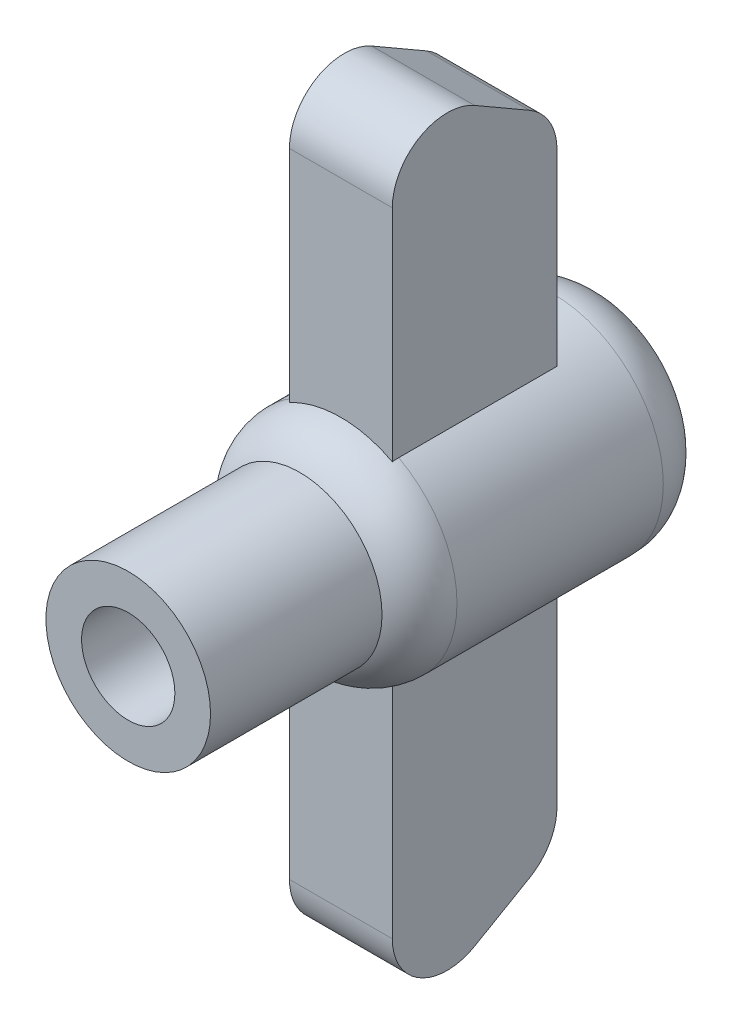
ISO-10303-21;
HEADER;
FILE_DESCRIPTION(('STEP AP214'),'2;1');
FILE_NAME('part.step','',(''),(''),'','','');
FILE_SCHEMA(('AUTOMOTIVE_DESIGN { 1 0 10303 214 1 1 1 1 }'));
ENDSEC;
DATA;
#1=APPLICATION_CONTEXT('core data for automotive mechanical design processes');
#2=APPLICATION_PROTOCOL_DEFINITION('international standard','automotive_design',2000,#1);
#3=PRODUCT_CONTEXT('',#1,'mechanical');
#4=PRODUCT('Part','Part','',(#3));
#5=PRODUCT_RELATED_PRODUCT_CATEGORY('part','',(#4));
#6=PRODUCT_DEFINITION_FORMATION('','',#4);
#7=PRODUCT_DEFINITION_CONTEXT('part definition',#1,'design');
#8=PRODUCT_DEFINITION('design','',#6,#7);
#9=PRODUCT_DEFINITION_SHAPE('','',#8);
#10=(LENGTH_UNIT() NAMED_UNIT(*) SI_UNIT(.MILLI.,.METRE.));
#11=(NAMED_UNIT(*) PLANE_ANGLE_UNIT() SI_UNIT($,.RADIAN.));
#12=(NAMED_UNIT(*) SI_UNIT($,.STERADIAN.) SOLID_ANGLE_UNIT());
#13=UNCERTAINTY_MEASURE_WITH_UNIT(LENGTH_MEASURE(1.E-05),#10,'distance_accuracy_value','');
#14=(GEOMETRIC_REPRESENTATION_CONTEXT(3) GLOBAL_UNCERTAINTY_ASSIGNED_CONTEXT((#13)) GLOBAL_UNIT_ASSIGNED_CONTEXT((#10,
#11,#12)) REPRESENTATION_CONTEXT('',''));
#15=CARTESIAN_POINT('',(0.,0.,0.));
#16=DIRECTION('',(0.,0.,1.));
#17=DIRECTION('',(1.,0.,0.));
#18=AXIS2_PLACEMENT_3D('',#15,#16,#17);
#19=CARTESIAN_POINT('',(0.,0.,0.));
#20=DIRECTION('',(0.,0.,1.));
#21=DIRECTION('',(1.,0.,0.));
#22=AXIS2_PLACEMENT_3D('',#19,#20,#21);
#23=CYLINDRICAL_SURFACE('',#22,7.99999999999999);
#24=CARTESIAN_POINT('',(0.,0.,-31.));
#25=DIRECTION('',(0.,0.,1.));
#26=DIRECTION('',(1.,0.,0.));
#27=AXIS2_PLACEMENT_3D('',#24,#25,#26);
#28=CIRCLE('',#27,7.99999999999999);
#29=CARTESIAN_POINT('',(7.99999999999999,0.,-31.));
#30=VERTEX_POINT('',#29);
#31=EDGE_CURVE('E241',#30,#30,#28,.T.);
#32=ORIENTED_EDGE('',*,*,#31,.T.);
#33=EDGE_LOOP('',(#32));
#34=FACE_BOUND('',#33,.T.);
#35=DIRECTION('',(0.,0.,1.));
#36=VECTOR('',#35,1.);
#37=CARTESIAN_POINT('',(3.75,7.06664701255127,0.));
#38=LINE('',#37,#36);
#39=CARTESIAN_POINT('',(3.75,7.06664701255127,-15.964101615138));
#40=VERTEX_POINT('',#39);
#41=CARTESIAN_POINT('',(3.75,7.06664701255128,-27.5));
#42=VERTEX_POINT('',#41);
#43=EDGE_CURVE('E203',#40,#42,#38,.F.);
#44=ORIENTED_EDGE('',*,*,#43,.F.);
#45=CARTESIAN_POINT('',(0.,0.,-15.9641016151378));
#46=DIRECTION('',(0.,0.,1.));
#47=DIRECTION('',(1.,0.,0.));
#48=AXIS2_PLACEMENT_3D('',#45,#46,#47);
#49=CIRCLE('',#48,7.99999999999999);
#50=CARTESIAN_POINT('',(3.75,-7.06664701255127,-15.964101615138));
#51=VERTEX_POINT('',#50);
#52=EDGE_CURVE('E246',#40,#51,#49,.F.);
#53=ORIENTED_EDGE('',*,*,#52,.T.);
#54=DIRECTION('',(0.,0.,1.));
#55=VECTOR('',#54,1.);
#56=CARTESIAN_POINT('',(3.75,-7.06664701255127,0.));
#57=LINE('',#56,#55);
#58=CARTESIAN_POINT('',(3.75,-7.06664701255128,-27.5));
#59=VERTEX_POINT('',#58);
#60=EDGE_CURVE('E196',#59,#51,#57,.T.);
#61=ORIENTED_EDGE('',*,*,#60,.F.);
#62=CARTESIAN_POINT('',(0.,0.,-27.5));
#63=DIRECTION('',(0.,0.,1.));
#64=DIRECTION('',(1.,0.,0.));
#65=AXIS2_PLACEMENT_3D('',#62,#63,#64);
#66=CIRCLE('',#65,7.99999999999999);
#67=CARTESIAN_POINT('',(-3.75,-7.06664701255128,-27.5));
#68=VERTEX_POINT('',#67);
#69=EDGE_CURVE('E193',#68,#59,#66,.T.);
#70=ORIENTED_EDGE('',*,*,#69,.F.);
#71=DIRECTION('',(0.,0.,1.));
#72=VECTOR('',#71,1.);
#73=CARTESIAN_POINT('',(-3.75,-7.06664701255127,0.));
#74=LINE('',#73,#72);
#75=CARTESIAN_POINT('',(-3.75,-7.06664701255127,-15.964101615138));
#76=VERTEX_POINT('',#75);
#77=EDGE_CURVE('E191',#76,#68,#74,.F.);
#78=ORIENTED_EDGE('',*,*,#77,.F.);
#79=CARTESIAN_POINT('',(0.,0.,-15.9641016151378));
#80=DIRECTION('',(0.,0.,1.));
#81=DIRECTION('',(1.,0.,0.));
#82=AXIS2_PLACEMENT_3D('',#79,#80,#81);
#83=CIRCLE('',#82,7.99999999999999);
#84=CARTESIAN_POINT('',(-3.75,7.06664701255127,-15.964101615138));
#85=VERTEX_POINT('',#84);
#86=EDGE_CURVE('E244',#76,#85,#83,.F.);
#87=ORIENTED_EDGE('',*,*,#86,.T.);
#88=DIRECTION('',(0.,0.,1.));
#89=VECTOR('',#88,1.);
#90=CARTESIAN_POINT('',(-3.75,7.06664701255127,0.));
#91=LINE('',#90,#89);
#92=CARTESIAN_POINT('',(-3.75,7.06664701255127,-27.5));
#93=VERTEX_POINT('',#92);
#94=EDGE_CURVE('E200',#93,#85,#91,.T.);
#95=ORIENTED_EDGE('',*,*,#94,.F.);
#96=EDGE_CURVE('E197',#42,#93,#66,.T.);
#97=ORIENTED_EDGE('',*,*,#96,.F.);
#98=EDGE_LOOP('',(#44,#53,#61,#70,#78,#87,#95,#97));
#99=FACE_BOUND('',#98,.T.);
#100=ADVANCED_FACE('F41',(#34,#99),#23,.T.);
#101=CARTESIAN_POINT('',(0.,0.,0.));
#102=DIRECTION('',(0.,0.,1.));
#103=DIRECTION('',(1.,0.,0.));
#104=AXIS2_PLACEMENT_3D('',#101,#102,#103);
#105=CYLINDRICAL_SURFACE('',#104,6.);
#106=CARTESIAN_POINT('',(0.,0.,0.));
#107=DIRECTION('',(0.,0.,1.));
#108=DIRECTION('',(1.,0.,0.));
#109=AXIS2_PLACEMENT_3D('',#106,#107,#108);
#110=CIRCLE('',#109,6.);
#111=CARTESIAN_POINT('',(6.,0.,0.));
#112=VERTEX_POINT('',#111);
#113=EDGE_CURVE('E185',#112,#112,#110,.T.);
#114=ORIENTED_EDGE('',*,*,#113,.F.);
#115=EDGE_LOOP('',(#114));
#116=FACE_BOUND('',#115,.T.);
#117=CARTESIAN_POINT('',(0.,0.,-12.5));
#118=DIRECTION('',(0.,0.,1.));
#119=DIRECTION('',(1.,0.,0.));
#120=AXIS2_PLACEMENT_3D('',#117,#118,#119);
#121=CIRCLE('',#120,6.);
#122=CARTESIAN_POINT('',(6.,0.,-12.5));
#123=VERTEX_POINT('',#122);
#124=EDGE_CURVE('E188',#123,#123,#121,.T.);
#125=ORIENTED_EDGE('',*,*,#124,.T.);
#126=EDGE_LOOP('',(#125));
#127=FACE_BOUND('',#126,.T.);
#128=ADVANCED_FACE('F313',(#116,#127),#105,.T.);
#129=CARTESIAN_POINT('',(0.,0.,0.));
#130=DIRECTION('',(0.,0.,-1.));
#131=DIRECTION('',(-1.,0.,0.));
#132=AXIS2_PLACEMENT_3D('',#129,#130,#131);
#133=PLANE('',#132);
#134=CARTESIAN_POINT('',(0.,0.,0.));
#135=DIRECTION('',(0.,0.,1.));
#136=DIRECTION('',(1.,0.,0.));
#137=AXIS2_PLACEMENT_3D('',#134,#135,#136);
#138=CIRCLE('',#137,3.4);
#139=CARTESIAN_POINT('',(3.4,0.,0.));
#140=VERTEX_POINT('',#139);
#141=EDGE_CURVE('E158',#140,#140,#138,.T.);
#142=ORIENTED_EDGE('',*,*,#141,.F.);
#143=EDGE_LOOP('',(#142));
#144=FACE_BOUND('',#143,.T.);
#145=ORIENTED_EDGE('',*,*,#113,.T.);
#146=EDGE_LOOP('',(#145));
#147=FACE_BOUND('',#146,.T.);
#148=ADVANCED_FACE('F319',(#144,#147),#133,.F.);
#149=CARTESIAN_POINT('',(0.,0.,-35.));
#150=DIRECTION('',(0.,0.,1.));
#151=DIRECTION('',(1.,0.,0.));
#152=AXIS2_PLACEMENT_3D('',#149,#150,#151);
#153=PLANE('',#152);
#154=CARTESIAN_POINT('',(0.,0.,-35.));
#155=DIRECTION('',(0.,0.,1.));
#156=DIRECTION('',(1.,0.,0.));
#157=AXIS2_PLACEMENT_3D('',#154,#155,#156);
#158=CIRCLE('',#157,3.99999999999999);
#159=CARTESIAN_POINT('',(3.99999999999999,0.,-35.));
#160=VERTEX_POINT('',#159);
#161=EDGE_CURVE('E249',#160,#160,#158,.F.);
#162=ORIENTED_EDGE('',*,*,#161,.T.);
#163=EDGE_LOOP('',(#162));
#164=FACE_BOUND('',#163,.T.);
#165=ADVANCED_FACE('F307',(#164),#153,.F.);
#166=CARTESIAN_POINT('',(-3.75,30.,-27.5));
#167=DIRECTION('',(1.,0.,0.));
#168=DIRECTION('',(0.,0.,-1.));
#169=AXIS2_PLACEMENT_3D('',#166,#167,#168);
#170=PLANE('',#169);
#171=DIRECTION('',(0.,-0.499999999999998,0.86602540378444));
#172=VECTOR('',#171,1.);
#173=CARTESIAN_POINT('',(-3.75,-9.80384757729349,-50.4807621135331));
#174=LINE('',#173,#172);
#175=CARTESIAN_POINT('',(-3.75,-24.2264973081038,-25.5));
#176=VERTEX_POINT('',#175);
#177=CARTESIAN_POINT('',(-3.75,-26.5358983848623,-21.5));
#178=VERTEX_POINT('',#177);
#179=EDGE_CURVE('E161',#176,#178,#174,.T.);
#180=ORIENTED_EDGE('',*,*,#179,.T.);
#181=CARTESIAN_POINT('',(-3.75,-23.0717967697245,-19.5));
#182=DIRECTION('',(1.,0.,0.));
#183=DIRECTION('',(0.,0.,-1.));
#184=AXIS2_PLACEMENT_3D('',#181,#182,#183);
#185=CIRCLE('',#184,4.);
#186=CARTESIAN_POINT('',(-3.75,-23.0717967697245,-15.5));
#187=VERTEX_POINT('',#186);
#188=EDGE_CURVE('E234',#178,#187,#185,.F.);
#189=ORIENTED_EDGE('',*,*,#188,.T.);
#190=DIRECTION('',(0.,-1.,0.));
#191=VECTOR('',#190,1.);
#192=CARTESIAN_POINT('',(-3.75,30.,-15.5));
#193=LINE('',#192,#191);
#194=CARTESIAN_POINT('',(-3.75,-7.03604928710821,-15.5));
#195=VERTEX_POINT('',#194);
#196=EDGE_CURVE('E174',#195,#187,#193,.T.);
#197=ORIENTED_EDGE('',*,*,#196,.F.);
#198=CARTESIAN_POINT('',(-3.75,-7.03604928710822,-15.5));
#199=CARTESIAN_POINT('',(-3.75,-7.0462411753592,-15.577014541361));
#200=CARTESIAN_POINT('',(-3.75,-7.05388692993827,-15.6541969466048));
#201=CARTESIAN_POINT('',(-3.75,-7.06408617176092,-15.8088974849835));
#202=CARTESIAN_POINT('',(-3.75,-7.0666396589962,-15.8864156181191));
#203=CARTESIAN_POINT('',(-3.75,-7.06664701255128,-15.964101615138));
#204=B_SPLINE_CURVE_WITH_KNOTS('',3,(#198,#199,#200,#201,#202,#203),.UNSPECIFIED.,.F.,.F.,(4,2,
4),(0.,0.232680534597515,0.46536106957416),.UNSPECIFIED.);
#205=EDGE_CURVE('E275',#195,#76,#204,.T.);
#206=ORIENTED_EDGE('',*,*,#205,.T.);
#207=ORIENTED_EDGE('',*,*,#77,.T.);
#208=DIRECTION('',(0.,-1.,0.));
#209=VECTOR('',#208,1.);
#210=CARTESIAN_POINT('',(-3.75,30.,-27.5));
#211=LINE('',#210,#209);
#212=CARTESIAN_POINT('',(-3.75,-20.762395692966,-27.5));
#213=VERTEX_POINT('',#212);
#214=EDGE_CURVE('E176',#68,#213,#211,.T.);
#215=ORIENTED_EDGE('',*,*,#214,.T.);
#216=CARTESIAN_POINT('',(-3.75,-20.762395692966,-23.5));
#217=DIRECTION('',(1.,0.,0.));
#218=DIRECTION('',(0.,0.,-1.));
#219=AXIS2_PLACEMENT_3D('',#216,#217,#218);
#220=CIRCLE('',#219,4.);
#221=EDGE_CURVE('E232',#213,#176,#220,.F.);
#222=ORIENTED_EDGE('',*,*,#221,.T.);
#223=EDGE_LOOP('',(#180,#189,#197,#206,#207,#215,#222));
#224=FACE_BOUND('',#223,.T.);
#225=ADVANCED_FACE('F294',(#224),#170,.F.);
#226=CARTESIAN_POINT('',(-3.75,30.,-27.5));
#227=DIRECTION('',(0.,0.,1.));
#228=DIRECTION('',(1.,0.,0.));
#229=AXIS2_PLACEMENT_3D('',#226,#227,#228);
#230=PLANE('',#229);
#231=DIRECTION('',(0.,-1.,0.));
#232=VECTOR('',#231,1.);
#233=CARTESIAN_POINT('',(3.75,30.,-27.5));
#234=LINE('',#233,#232);
#235=CARTESIAN_POINT('',(3.75,-20.762395692966,-27.5));
#236=VERTEX_POINT('',#235);
#237=EDGE_CURVE('E179',#59,#236,#234,.T.);
#238=ORIENTED_EDGE('',*,*,#237,.T.);
#239=DIRECTION('',(1.,0.,0.));
#240=VECTOR('',#239,1.);
#241=CARTESIAN_POINT('',(-3.75,-20.762395692966,-27.5));
#242=LINE('',#241,#240);
#243=EDGE_CURVE('E236',#236,#213,#242,.F.);
#244=ORIENTED_EDGE('',*,*,#243,.T.);
#245=ORIENTED_EDGE('',*,*,#214,.F.);
#246=ORIENTED_EDGE('',*,*,#69,.T.);
#247=EDGE_LOOP('',(#238,#244,#245,#246));
#248=FACE_BOUND('',#247,.T.);
#249=ADVANCED_FACE('F296',(#248),#230,.F.);
#250=CARTESIAN_POINT('',(3.75,30.,-15.5));
#251=DIRECTION('',(-1.,0.,0.));
#252=DIRECTION('',(0.,0.,1.));
#253=AXIS2_PLACEMENT_3D('',#250,#251,#252);
#254=PLANE('',#253);
#255=DIRECTION('',(0.,-1.,0.));
#256=VECTOR('',#255,1.);
#257=CARTESIAN_POINT('',(3.75,30.,-15.5));
#258=LINE('',#257,#256);
#259=CARTESIAN_POINT('',(3.75,-7.03604928710821,-15.5));
#260=VERTEX_POINT('',#259);
#261=CARTESIAN_POINT('',(3.75,-23.0717967697245,-15.5));
#262=VERTEX_POINT('',#261);
#263=EDGE_CURVE('E183',#260,#262,#258,.T.);
#264=ORIENTED_EDGE('',*,*,#263,.T.);
#265=CARTESIAN_POINT('',(3.75,-23.0717967697245,-19.5));
#266=DIRECTION('',(-1.,0.,0.));
#267=DIRECTION('',(0.,0.,1.));
#268=AXIS2_PLACEMENT_3D('',#265,#266,#267);
#269=CIRCLE('',#268,4.);
#270=CARTESIAN_POINT('',(3.75,-26.5358983848623,-21.5));
#271=VERTEX_POINT('',#270);
#272=EDGE_CURVE('E225',#262,#271,#269,.F.);
#273=ORIENTED_EDGE('',*,*,#272,.T.);
#274=DIRECTION('',(0.,0.499999999999998,-0.86602540378444));
#275=VECTOR('',#274,1.);
#276=CARTESIAN_POINT('',(3.75,-15.0000000000001,-41.4807621135331));
#277=LINE('',#276,#275);
#278=CARTESIAN_POINT('',(3.75,-24.2264973081038,-25.5));
#279=VERTEX_POINT('',#278);
#280=EDGE_CURVE('E157',#271,#279,#277,.T.);
#281=ORIENTED_EDGE('',*,*,#280,.T.);
#282=CARTESIAN_POINT('',(3.75,-20.762395692966,-23.5));
#283=DIRECTION('',(-1.,0.,0.));
#284=DIRECTION('',(0.,0.,1.));
#285=AXIS2_PLACEMENT_3D('',#282,#283,#284);
#286=CIRCLE('',#285,4.);
#287=EDGE_CURVE('E223',#279,#236,#286,.F.);
#288=ORIENTED_EDGE('',*,*,#287,.T.);
#289=ORIENTED_EDGE('',*,*,#237,.F.);
#290=ORIENTED_EDGE('',*,*,#60,.T.);
#291=CARTESIAN_POINT('',(3.75,-7.06664701255128,-15.9641016151378));
#292=CARTESIAN_POINT('',(3.75,-7.0666396589962,-15.886415618119));
#293=CARTESIAN_POINT('',(3.75,-7.06408617176092,-15.8088974849834));
#294=CARTESIAN_POINT('',(3.75,-7.05388692993827,-15.6541969466047));
#295=CARTESIAN_POINT('',(3.75,-7.04624117535919,-15.577014541361));
#296=CARTESIAN_POINT('',(3.75,-7.03604928710822,-15.5));
#297=B_SPLINE_CURVE_WITH_KNOTS('',3,(#291,#292,#293,#294,#295,#296),.UNSPECIFIED.,.F.,.F.,(4,2,
4),(0.,0.232680534976549,0.465361069573966),.UNSPECIFIED.);
#298=EDGE_CURVE('E252',#51,#260,#297,.T.);
#299=ORIENTED_EDGE('',*,*,#298,.T.);
#300=EDGE_LOOP('',(#264,#273,#281,#288,#289,#290,#299));
#301=FACE_BOUND('',#300,.T.);
#302=ADVANCED_FACE('F261',(#301),#254,.F.);
#303=CARTESIAN_POINT('',(3.75,30.,-15.5));
#304=DIRECTION('',(0.,0.,-1.));
#305=DIRECTION('',(-1.,0.,0.));
#306=AXIS2_PLACEMENT_3D('',#303,#304,#305);
#307=PLANE('',#306);
#308=ORIENTED_EDGE('',*,*,#196,.T.);
#309=DIRECTION('',(1.,0.,0.));
#310=VECTOR('',#309,1.);
#311=CARTESIAN_POINT('',(3.75,-23.0717967697245,-15.5));
#312=LINE('',#311,#310);
#313=EDGE_CURVE('E220',#187,#262,#312,.T.);
#314=ORIENTED_EDGE('',*,*,#313,.T.);
#315=ORIENTED_EDGE('',*,*,#263,.F.);
#316=CARTESIAN_POINT('',(0.,0.,-15.5));
#317=DIRECTION('',(0.,0.,1.));
#318=DIRECTION('',(1.,0.,0.));
#319=AXIS2_PLACEMENT_3D('',#316,#317,#318);
#320=CIRCLE('',#319,7.9729849849737);
#321=EDGE_CURVE('E259',#260,#195,#320,.F.);
#322=ORIENTED_EDGE('',*,*,#321,.T.);
#323=EDGE_LOOP('',(#308,#314,#315,#322));
#324=FACE_BOUND('',#323,.T.);
#325=ADVANCED_FACE('F304',(#324),#307,.F.);
#326=CARTESIAN_POINT('',(3.75,23.0717967697245,-15.5));
#327=VERTEX_POINT('',#326);
#328=CARTESIAN_POINT('',(3.75,7.03604928710822,-15.5));
#329=VERTEX_POINT('',#328);
#330=EDGE_CURVE('E60',#327,#329,#258,.T.);
#331=ORIENTED_EDGE('',*,*,#330,.F.);
#332=DIRECTION('',(1.,0.,0.));
#333=VECTOR('',#332,1.);
#334=CARTESIAN_POINT('',(3.75,23.0717967697245,-15.5));
#335=LINE('',#334,#333);
#336=CARTESIAN_POINT('',(-3.75,23.0717967697245,-15.5));
#337=VERTEX_POINT('',#336);
#338=EDGE_CURVE('E214',#327,#337,#335,.F.);
#339=ORIENTED_EDGE('',*,*,#338,.T.);
#340=CARTESIAN_POINT('',(-3.75,7.03604928710822,-15.5));
#341=VERTEX_POINT('',#340);
#342=EDGE_CURVE('E67',#337,#341,#193,.T.);
#343=ORIENTED_EDGE('',*,*,#342,.T.);
#344=CARTESIAN_POINT('',(0.,0.,-15.5));
#345=DIRECTION('',(0.,0.,1.));
#346=DIRECTION('',(1.,0.,0.));
#347=AXIS2_PLACEMENT_3D('',#344,#345,#346);
#348=CIRCLE('',#347,7.9729849849737);
#349=EDGE_CURVE('E54',#341,#329,#348,.F.);
#350=ORIENTED_EDGE('',*,*,#349,.T.);
#351=EDGE_LOOP('',(#331,#339,#343,#350));
#352=FACE_BOUND('',#351,.T.);
#353=ADVANCED_FACE('F384',(#352),#307,.F.);
#354=DIRECTION('',(0.,0.500000000000004,0.866025403784436));
#355=VECTOR('',#354,1.);
#356=CARTESIAN_POINT('',(3.75,30.,-15.5));
#357=LINE('',#356,#355);
#358=CARTESIAN_POINT('',(3.75,24.2264973081037,-25.5));
#359=VERTEX_POINT('',#358);
#360=CARTESIAN_POINT('',(3.75,26.5358983848622,-21.5));
#361=VERTEX_POINT('',#360);
#362=EDGE_CURVE('E171',#359,#361,#357,.T.);
#363=ORIENTED_EDGE('',*,*,#362,.T.);
#364=CARTESIAN_POINT('',(3.75,23.0717967697245,-19.5));
#365=DIRECTION('',(-1.,0.,0.));
#366=DIRECTION('',(0.,0.,1.));
#367=AXIS2_PLACEMENT_3D('',#364,#365,#366);
#368=CIRCLE('',#367,4.);
#369=EDGE_CURVE('E212',#361,#327,#368,.F.);
#370=ORIENTED_EDGE('',*,*,#369,.T.);
#371=ORIENTED_EDGE('',*,*,#330,.T.);
#372=CARTESIAN_POINT('',(3.75,7.03604928710822,-15.5));
#373=CARTESIAN_POINT('',(3.75,7.04624117535919,-15.577014541361));
#374=CARTESIAN_POINT('',(3.75,7.05388692993827,-15.6541969466047));
#375=CARTESIAN_POINT('',(3.75,7.06408617176092,-15.8088974849834));
#376=CARTESIAN_POINT('',(3.75,7.06663965899619,-15.886415618119));
#377=CARTESIAN_POINT('',(3.75,7.06664701255128,-15.9641016151378));
#378=B_SPLINE_CURVE_WITH_KNOTS('',3,(#372,#373,#374,#375,#376,#377),.UNSPECIFIED.,.F.,.F.,(4,2,
4),(0.,0.232680534597417,0.465361069573969),.UNSPECIFIED.);
#379=EDGE_CURVE('E11',#329,#40,#378,.T.);
#380=ORIENTED_EDGE('',*,*,#379,.T.);
#381=ORIENTED_EDGE('',*,*,#43,.T.);
#382=CARTESIAN_POINT('',(3.75,20.7623956929659,-27.5));
#383=VERTEX_POINT('',#382);
#384=EDGE_CURVE('E180',#383,#42,#234,.T.);
#385=ORIENTED_EDGE('',*,*,#384,.F.);
#386=CARTESIAN_POINT('',(3.75,20.7623956929659,-23.5));
#387=DIRECTION('',(-1.,0.,0.));
#388=DIRECTION('',(0.,0.,1.));
#389=AXIS2_PLACEMENT_3D('',#386,#387,#388);
#390=CIRCLE('',#389,4.);
#391=EDGE_CURVE('E210',#383,#359,#390,.F.);
#392=ORIENTED_EDGE('',*,*,#391,.T.);
#393=EDGE_LOOP('',(#363,#370,#371,#380,#381,#385,#392));
#394=FACE_BOUND('',#393,.T.);
#395=ADVANCED_FACE('F306',(#394),#254,.F.);
#396=CARTESIAN_POINT('',(-3.75,20.7623956929659,-27.5));
#397=VERTEX_POINT('',#396);
#398=EDGE_CURVE('E177',#397,#93,#211,.T.);
#399=ORIENTED_EDGE('',*,*,#398,.F.);
#400=DIRECTION('',(1.,0.,0.));
#401=VECTOR('',#400,1.);
#402=CARTESIAN_POINT('',(-3.75,20.7623956929659,-27.5));
#403=LINE('',#402,#401);
#404=EDGE_CURVE('E238',#397,#383,#403,.T.);
#405=ORIENTED_EDGE('',*,*,#404,.T.);
#406=ORIENTED_EDGE('',*,*,#384,.T.);
#407=ORIENTED_EDGE('',*,*,#96,.T.);
#408=EDGE_LOOP('',(#399,#405,#406,#407));
#409=FACE_BOUND('',#408,.T.);
#410=ADVANCED_FACE('F292',(#409),#230,.F.);
#411=ORIENTED_EDGE('',*,*,#342,.F.);
#412=CARTESIAN_POINT('',(-3.75,23.0717967697245,-19.5));
#413=DIRECTION('',(1.,0.,0.));
#414=DIRECTION('',(0.,0.,-1.));
#415=AXIS2_PLACEMENT_3D('',#412,#413,#414);
#416=CIRCLE('',#415,4.);
#417=CARTESIAN_POINT('',(-3.75,26.5358983848622,-21.5));
#418=VERTEX_POINT('',#417);
#419=EDGE_CURVE('E218',#337,#418,#416,.F.);
#420=ORIENTED_EDGE('',*,*,#419,.T.);
#421=DIRECTION('',(0.,-0.500000000000004,-0.866025403784436));
#422=VECTOR('',#421,1.);
#423=CARTESIAN_POINT('',(-3.75,24.8038475772933,-24.5));
#424=LINE('',#423,#422);
#425=CARTESIAN_POINT('',(-3.75,24.2264973081037,-25.5));
#426=VERTEX_POINT('',#425);
#427=EDGE_CURVE('E168',#418,#426,#424,.T.);
#428=ORIENTED_EDGE('',*,*,#427,.T.);
#429=CARTESIAN_POINT('',(-3.75,20.7623956929659,-23.5));
#430=DIRECTION('',(1.,0.,0.));
#431=DIRECTION('',(0.,0.,-1.));
#432=AXIS2_PLACEMENT_3D('',#429,#430,#431);
#433=CIRCLE('',#432,4.);
#434=EDGE_CURVE('E216',#426,#397,#433,.F.);
#435=ORIENTED_EDGE('',*,*,#434,.T.);
#436=ORIENTED_EDGE('',*,*,#398,.T.);
#437=ORIENTED_EDGE('',*,*,#94,.T.);
#438=CARTESIAN_POINT('',(-3.75,7.06664701255127,-15.9641016151378));
#439=CARTESIAN_POINT('',(-3.75,7.0666396589962,-15.886415618119));
#440=CARTESIAN_POINT('',(-3.75,7.06408617176092,-15.8088974849834));
#441=CARTESIAN_POINT('',(-3.75,7.05388692993827,-15.6541969466047));
#442=CARTESIAN_POINT('',(-3.75,7.04624117535919,-15.577014541361));
#443=CARTESIAN_POINT('',(-3.75,7.03604928710822,-15.5));
#444=B_SPLINE_CURVE_WITH_KNOTS('',3,(#438,#439,#440,#441,#442,#443),.UNSPECIFIED.,.F.,.F.,(4,2,
4),(0.,0.232680534976548,0.465361069573966),.UNSPECIFIED.);
#445=EDGE_CURVE('E282',#85,#341,#444,.T.);
#446=ORIENTED_EDGE('',*,*,#445,.T.);
#447=EDGE_LOOP('',(#411,#420,#428,#435,#436,#437,#446));
#448=FACE_BOUND('',#447,.T.);
#449=ADVANCED_FACE('F287',(#448),#170,.F.);
#450=CARTESIAN_POINT('',(-7.99999999999999,30.,-15.5));
#451=DIRECTION('',(0.,-0.866025403784436,0.500000000000004));
#452=DIRECTION('',(0.,-0.500000000000004,-0.866025403784436));
#453=AXIS2_PLACEMENT_3D('',#450,#451,#452);
#454=PLANE('',#453);
#455=ORIENTED_EDGE('',*,*,#427,.F.);
#456=DIRECTION('',(1.,0.,0.));
#457=VECTOR('',#456,1.);
#458=CARTESIAN_POINT('',(-7.99999999999999,26.5358983848622,-21.5));
#459=LINE('',#458,#457);
#460=EDGE_CURVE('E207',#418,#361,#459,.T.);
#461=ORIENTED_EDGE('',*,*,#460,.T.);
#462=ORIENTED_EDGE('',*,*,#362,.F.);
#463=DIRECTION('',(1.,0.,0.));
#464=VECTOR('',#463,1.);
#465=CARTESIAN_POINT('',(-7.99999999999999,24.2264973081037,-25.5));
#466=LINE('',#465,#464);
#467=EDGE_CURVE('E205',#359,#426,#466,.F.);
#468=ORIENTED_EDGE('',*,*,#467,.T.);
#469=EDGE_LOOP('',(#455,#461,#462,#468));
#470=FACE_BOUND('',#469,.T.);
#471=ADVANCED_FACE('F291',(#470),#454,.F.);
#472=CARTESIAN_POINT('',(-7.99999999999999,-30.,-15.5));
#473=DIRECTION('',(0.,0.86602540378444,0.499999999999998));
#474=DIRECTION('',(0.,-0.499999999999998,0.86602540378444));
#475=AXIS2_PLACEMENT_3D('',#472,#473,#474);
#476=PLANE('',#475);
#477=ORIENTED_EDGE('',*,*,#280,.F.);
#478=DIRECTION('',(1.,0.,0.));
#479=VECTOR('',#478,1.);
#480=CARTESIAN_POINT('',(-7.99999999999999,-26.5358983848623,-21.5));
#481=LINE('',#480,#479);
#482=EDGE_CURVE('E230',#271,#178,#481,.F.);
#483=ORIENTED_EDGE('',*,*,#482,.T.);
#484=ORIENTED_EDGE('',*,*,#179,.F.);
#485=DIRECTION('',(1.,0.,0.));
#486=VECTOR('',#485,1.);
#487=CARTESIAN_POINT('',(-7.99999999999999,-24.2264973081038,-25.5));
#488=LINE('',#487,#486);
#489=EDGE_CURVE('E227',#176,#279,#488,.T.);
#490=ORIENTED_EDGE('',*,*,#489,.T.);
#491=EDGE_LOOP('',(#477,#483,#484,#490));
#492=FACE_BOUND('',#491,.T.);
#493=ADVANCED_FACE('F151',(#492),#476,.F.);
#494=CARTESIAN_POINT('',(0.,0.,-20.));
#495=DIRECTION('',(0.,0.,1.));
#496=DIRECTION('',(1.,0.,0.));
#497=AXIS2_PLACEMENT_3D('',#494,#495,#496);
#498=CONICAL_SURFACE('',#497,3.4,1.02974425867665);
#499=CARTESIAN_POINT('',(0.,0.,-22.0429261046937));
#500=VERTEX_POINT('',#499);
#501=VERTEX_LOOP('',#500);
#502=FACE_BOUND('',#501,.T.);
#503=CARTESIAN_POINT('',(0.,0.,-20.));
#504=DIRECTION('',(0.,0.,1.));
#505=DIRECTION('',(1.,0.,0.));
#506=AXIS2_PLACEMENT_3D('',#503,#504,#505);
#507=CIRCLE('',#506,3.4);
#508=CARTESIAN_POINT('',(3.4,0.,-20.));
#509=VERTEX_POINT('',#508);
#510=EDGE_CURVE('E155',#509,#509,#507,.T.);
#511=ORIENTED_EDGE('',*,*,#510,.T.);
#512=EDGE_LOOP('',(#511));
#513=FACE_BOUND('',#512,.T.);
#514=ADVANCED_FACE('F147',(#502,#513),#498,.F.);
#515=CARTESIAN_POINT('',(0.,0.,0.));
#516=DIRECTION('',(0.,0.,1.));
#517=DIRECTION('',(1.,0.,0.));
#518=AXIS2_PLACEMENT_3D('',#515,#516,#517);
#519=CYLINDRICAL_SURFACE('',#518,3.4);
#520=ORIENTED_EDGE('',*,*,#510,.F.);
#521=EDGE_LOOP('',(#520));
#522=FACE_BOUND('',#521,.T.);
#523=ORIENTED_EDGE('',*,*,#141,.T.);
#524=EDGE_LOOP('',(#523));
#525=FACE_BOUND('',#524,.T.);
#526=ADVANCED_FACE('F150',(#522,#525),#519,.F.);
#527=CARTESIAN_POINT('',(-7.99999999999999,23.0717967697245,-19.5));
#528=DIRECTION('',(1.,0.,0.));
#529=DIRECTION('',(0.,0.,-1.));
#530=AXIS2_PLACEMENT_3D('',#527,#528,#529);
#531=CYLINDRICAL_SURFACE('',#530,4.);
#532=ORIENTED_EDGE('',*,*,#419,.F.);
#533=ORIENTED_EDGE('',*,*,#338,.F.);
#534=ORIENTED_EDGE('',*,*,#369,.F.);
#535=ORIENTED_EDGE('',*,*,#460,.F.);
#536=EDGE_LOOP('',(#532,#533,#534,#535));
#537=FACE_BOUND('',#536,.T.);
#538=ADVANCED_FACE('F330',(#537),#531,.T.);
#539=CARTESIAN_POINT('',(3.75,-23.0717967697245,-19.5));
#540=DIRECTION('',(1.,0.,0.));
#541=DIRECTION('',(0.,0.,-1.));
#542=AXIS2_PLACEMENT_3D('',#539,#540,#541);
#543=CYLINDRICAL_SURFACE('',#542,4.);
#544=ORIENTED_EDGE('',*,*,#188,.F.);
#545=ORIENTED_EDGE('',*,*,#482,.F.);
#546=ORIENTED_EDGE('',*,*,#272,.F.);
#547=ORIENTED_EDGE('',*,*,#313,.F.);
#548=EDGE_LOOP('',(#544,#545,#546,#547));
#549=FACE_BOUND('',#548,.T.);
#550=ADVANCED_FACE('F333',(#549),#543,.T.);
#551=CARTESIAN_POINT('',(-7.99999999999999,-20.762395692966,-23.5));
#552=DIRECTION('',(1.,0.,0.));
#553=DIRECTION('',(0.,0.,-1.));
#554=AXIS2_PLACEMENT_3D('',#551,#552,#553);
#555=CYLINDRICAL_SURFACE('',#554,4.);
#556=ORIENTED_EDGE('',*,*,#221,.F.);
#557=ORIENTED_EDGE('',*,*,#243,.F.);
#558=ORIENTED_EDGE('',*,*,#287,.F.);
#559=ORIENTED_EDGE('',*,*,#489,.F.);
#560=EDGE_LOOP('',(#556,#557,#558,#559));
#561=FACE_BOUND('',#560,.T.);
#562=ADVANCED_FACE('F336',(#561),#555,.T.);
#563=CARTESIAN_POINT('',(-3.75,20.7623956929659,-23.5));
#564=DIRECTION('',(1.,0.,0.));
#565=DIRECTION('',(0.,0.,-1.));
#566=AXIS2_PLACEMENT_3D('',#563,#564,#565);
#567=CYLINDRICAL_SURFACE('',#566,4.);
#568=ORIENTED_EDGE('',*,*,#434,.F.);
#569=ORIENTED_EDGE('',*,*,#467,.F.);
#570=ORIENTED_EDGE('',*,*,#391,.F.);
#571=ORIENTED_EDGE('',*,*,#404,.F.);
#572=EDGE_LOOP('',(#568,#569,#570,#571));
#573=FACE_BOUND('',#572,.T.);
#574=ADVANCED_FACE('F269',(#573),#567,.T.);
#575=CARTESIAN_POINT('',(0.,0.,-15.9641016151378));
#576=DIRECTION('',(0.,0.,1.));
#577=DIRECTION('',(1.,0.,0.));
#578=AXIS2_PLACEMENT_3D('',#575,#576,#577);
#579=DEGENERATE_TOROIDAL_SURFACE('',#578,3.99999999999999,4.,.T.);
#580=ORIENTED_EDGE('',*,*,#298,.F.);
#581=ORIENTED_EDGE('',*,*,#52,.F.);
#582=ORIENTED_EDGE('',*,*,#379,.F.);
#583=ORIENTED_EDGE('',*,*,#349,.F.);
#584=ORIENTED_EDGE('',*,*,#445,.F.);
#585=ORIENTED_EDGE('',*,*,#86,.F.);
#586=ORIENTED_EDGE('',*,*,#205,.F.);
#587=ORIENTED_EDGE('',*,*,#321,.F.);
#588=EDGE_LOOP('',(#580,#581,#582,#583,#584,#585,#586,#587));
#589=FACE_BOUND('',#588,.T.);
#590=ORIENTED_EDGE('',*,*,#124,.F.);
#591=EDGE_LOOP('',(#590));
#592=FACE_BOUND('',#591,.T.);
#593=ADVANCED_FACE('F265',(#589,#592),#579,.T.);
#594=CARTESIAN_POINT('',(0.,0.,-31.));
#595=DIRECTION('',(0.,0.,1.));
#596=DIRECTION('',(1.,0.,0.));
#597=AXIS2_PLACEMENT_3D('',#594,#595,#596);
#598=DEGENERATE_TOROIDAL_SURFACE('',#597,3.99999999999999,4.,.T.);
#599=ORIENTED_EDGE('',*,*,#161,.F.);
#600=EDGE_LOOP('',(#599));
#601=FACE_BOUND('',#600,.T.);
#602=ORIENTED_EDGE('',*,*,#31,.F.);
#603=EDGE_LOOP('',(#602));
#604=FACE_BOUND('',#603,.T.);
#605=ADVANCED_FACE('F43',(#601,#604),#598,.T.);
#606=CLOSED_SHELL('',(#100,#128,#148,#165,#225,#249,#302,#325,#353,#395,#410,#449,#471,#493,
#514,#526,#538,#550,#562,#574,#593,#605));
#607=MANIFOLD_SOLID_BREP('B2',#606);
#608=ADVANCED_BREP_SHAPE_REPRESENTATION('',(#18,#607),#14);
#609=SHAPE_DEFINITION_REPRESENTATION(#9,#608);
ENDSEC;
END-ISO-10303-21;
